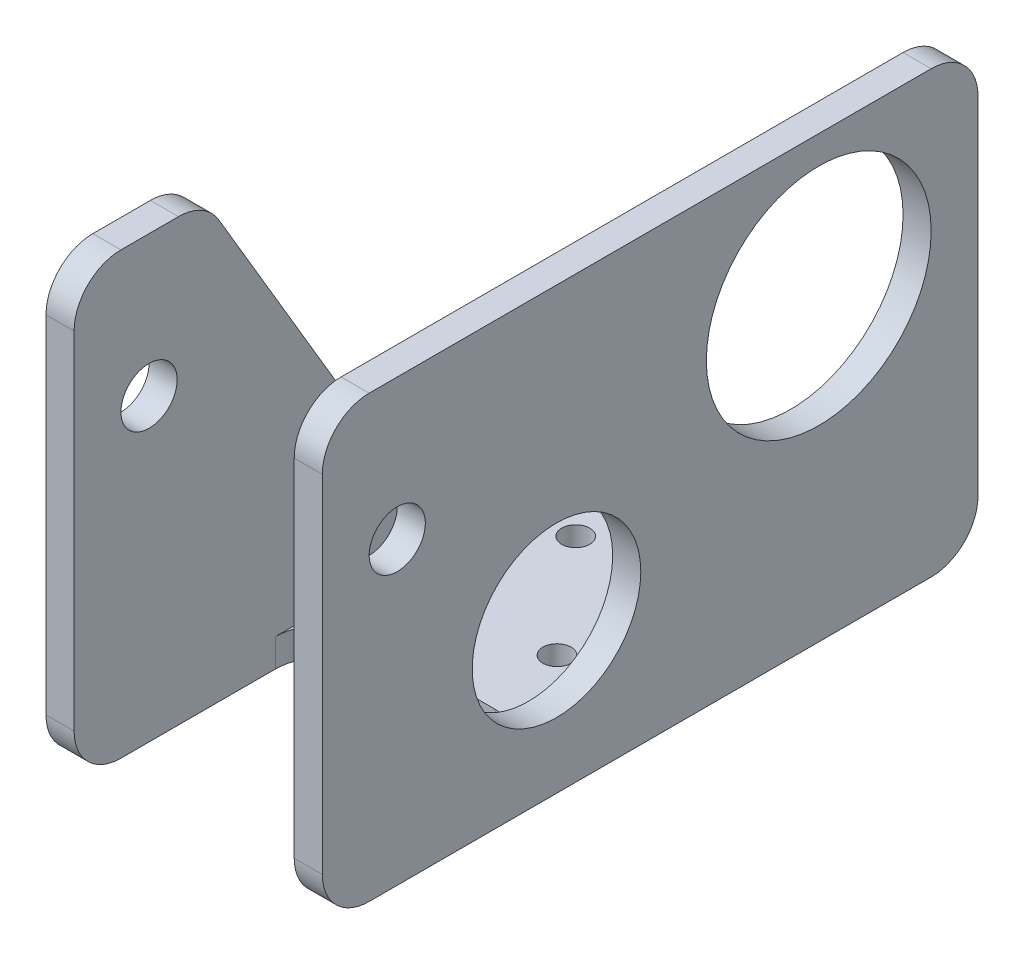
ISO-10303-21;
HEADER;
FILE_DESCRIPTION(('STEP AP214'),'2;1');
FILE_NAME('part.step','',(''),(''),'','','');
FILE_SCHEMA(('AUTOMOTIVE_DESIGN { 1 0 10303 214 1 1 1 1 }'));
ENDSEC;
DATA;
#1=APPLICATION_CONTEXT('core data for automotive mechanical design processes');
#2=APPLICATION_PROTOCOL_DEFINITION('international standard','automotive_design',2000,#1);
#3=PRODUCT_CONTEXT('',#1,'mechanical');
#4=PRODUCT('Part','Part','',(#3));
#5=PRODUCT_RELATED_PRODUCT_CATEGORY('part','',(#4));
#6=PRODUCT_DEFINITION_FORMATION('','',#4);
#7=PRODUCT_DEFINITION_CONTEXT('part definition',#1,'design');
#8=PRODUCT_DEFINITION('design','',#6,#7);
#9=PRODUCT_DEFINITION_SHAPE('','',#8);
#10=(LENGTH_UNIT() NAMED_UNIT(*) SI_UNIT(.MILLI.,.METRE.));
#11=(NAMED_UNIT(*) PLANE_ANGLE_UNIT() SI_UNIT($,.RADIAN.));
#12=(NAMED_UNIT(*) SI_UNIT($,.STERADIAN.) SOLID_ANGLE_UNIT());
#13=UNCERTAINTY_MEASURE_WITH_UNIT(LENGTH_MEASURE(1.E-05),#10,'distance_accuracy_value','');
#14=(GEOMETRIC_REPRESENTATION_CONTEXT(3) GLOBAL_UNCERTAINTY_ASSIGNED_CONTEXT((#13)) GLOBAL_UNIT_ASSIGNED_CONTEXT((#10,
#11,#12)) REPRESENTATION_CONTEXT('',''));
#15=CARTESIAN_POINT('',(0.,0.,0.));
#16=DIRECTION('',(0.,0.,1.));
#17=DIRECTION('',(1.,0.,0.));
#18=AXIS2_PLACEMENT_3D('',#15,#16,#17);
#19=CARTESIAN_POINT('',(0.,0.,70.));
#20=DIRECTION('',(0.,0.,-1.));
#21=DIRECTION('',(-1.,0.,0.));
#22=AXIS2_PLACEMENT_3D('',#19,#20,#21);
#23=PLANE('',#22);
#24=DIRECTION('',(0.,-1.,0.));
#25=VECTOR('',#24,1.);
#26=CARTESIAN_POINT('',(3.,3.,70.));
#27=LINE('',#26,#25);
#28=CARTESIAN_POINT('',(3.,42.,70.));
#29=VERTEX_POINT('',#28);
#30=CARTESIAN_POINT('',(3.,5.,70.));
#31=VERTEX_POINT('',#30);
#32=EDGE_CURVE('E263',#29,#31,#27,.T.);
#33=ORIENTED_EDGE('',*,*,#32,.F.);
#34=DIRECTION('',(-1.,0.,0.));
#35=VECTOR('',#34,1.);
#36=CARTESIAN_POINT('',(0.,42.,70.));
#37=LINE('',#36,#35);
#38=CARTESIAN_POINT('',(0.,42.,70.));
#39=VERTEX_POINT('',#38);
#40=EDGE_CURVE('E387',#29,#39,#37,.T.);
#41=ORIENTED_EDGE('',*,*,#40,.T.);
#42=DIRECTION('',(0.,-1.,0.));
#43=VECTOR('',#42,1.);
#44=CARTESIAN_POINT('',(0.,0.,70.));
#45=LINE('',#44,#43);
#46=CARTESIAN_POINT('',(0.,5.,70.));
#47=VERTEX_POINT('',#46);
#48=EDGE_CURVE('E277',#39,#47,#45,.T.);
#49=ORIENTED_EDGE('',*,*,#48,.T.);
#50=DIRECTION('',(1.,0.,0.));
#51=VECTOR('',#50,1.);
#52=CARTESIAN_POINT('',(0.,5.,70.));
#53=LINE('',#52,#51);
#54=EDGE_CURVE('E313',#47,#31,#53,.T.);
#55=ORIENTED_EDGE('',*,*,#54,.T.);
#56=EDGE_LOOP('',(#33,#41,#49,#55));
#57=FACE_BOUND('',#56,.T.);
#58=ADVANCED_FACE('F35',(#57),#23,.F.);
#59=CARTESIAN_POINT('',(0.,47.,70.));
#60=DIRECTION('',(0.,-1.,0.));
#61=DIRECTION('',(0.,0.,-1.));
#62=AXIS2_PLACEMENT_3D('',#59,#60,#61);
#63=PLANE('',#62);
#64=DIRECTION('',(0.,0.,1.));
#65=VECTOR('',#64,1.);
#66=CARTESIAN_POINT('',(3.,47.,0.));
#67=LINE('',#66,#65);
#68=CARTESIAN_POINT('',(3.,47.,58.8531510632639));
#69=VERTEX_POINT('',#68);
#70=CARTESIAN_POINT('',(3.,47.,65.));
#71=VERTEX_POINT('',#70);
#72=EDGE_CURVE('E267',#69,#71,#67,.T.);
#73=ORIENTED_EDGE('',*,*,#72,.F.);
#74=DIRECTION('',(1.,0.,0.));
#75=VECTOR('',#74,1.);
#76=CARTESIAN_POINT('',(0.,47.,58.8531510632639));
#77=LINE('',#76,#75);
#78=CARTESIAN_POINT('',(0.,47.,58.8531510632639));
#79=VERTEX_POINT('',#78);
#80=EDGE_CURVE('E350',#69,#79,#77,.F.);
#81=ORIENTED_EDGE('',*,*,#80,.T.);
#82=DIRECTION('',(0.,0.,-1.));
#83=VECTOR('',#82,1.);
#84=CARTESIAN_POINT('',(0.,47.,70.));
#85=LINE('',#84,#83);
#86=CARTESIAN_POINT('',(0.,47.,65.));
#87=VERTEX_POINT('',#86);
#88=EDGE_CURVE('E281',#87,#79,#85,.T.);
#89=ORIENTED_EDGE('',*,*,#88,.F.);
#90=DIRECTION('',(-1.,0.,0.));
#91=VECTOR('',#90,1.);
#92=CARTESIAN_POINT('',(0.,47.,65.));
#93=LINE('',#92,#91);
#94=EDGE_CURVE('E348',#87,#71,#93,.F.);
#95=ORIENTED_EDGE('',*,*,#94,.T.);
#96=EDGE_LOOP('',(#73,#81,#89,#95));
#97=FACE_BOUND('',#96,.T.);
#98=ADVANCED_FACE('F469',(#97),#63,.F.);
#99=CARTESIAN_POINT('',(0.,0.,70.));
#100=DIRECTION('',(1.,0.,0.));
#101=DIRECTION('',(0.,0.,-1.));
#102=AXIS2_PLACEMENT_3D('',#99,#100,#101);
#103=PLANE('',#102);
#104=CARTESIAN_POINT('',(0.,32.,62.));
#105=DIRECTION('',(1.,0.,0.));
#106=DIRECTION('',(0.,0.,-1.));
#107=AXIS2_PLACEMENT_3D('',#104,#105,#106);
#108=CIRCLE('',#107,3.00000000000001);
#109=CARTESIAN_POINT('',(0.,32.,59.));
#110=VERTEX_POINT('',#109);
#111=EDGE_CURVE('E255',#110,#110,#108,.T.);
#112=ORIENTED_EDGE('',*,*,#111,.T.);
#113=EDGE_LOOP('',(#112));
#114=FACE_BOUND('',#113,.T.);
#115=ORIENTED_EDGE('',*,*,#88,.T.);
#116=CARTESIAN_POINT('',(0.,42.,58.8531510632639));
#117=DIRECTION('',(1.,0.,0.));
#118=DIRECTION('',(0.,0.,-1.));
#119=AXIS2_PLACEMENT_3D('',#116,#117,#118);
#120=CIRCLE('',#119,5.);
#121=CARTESIAN_POINT('',(0.,44.5436465606332,54.5485184221924));
#122=VERTEX_POINT('',#121);
#123=EDGE_CURVE('E357',#79,#122,#120,.F.);
#124=ORIENTED_EDGE('',*,*,#123,.T.);
#125=DIRECTION('',(0.,-0.860926528214316,-0.508729312126641));
#126=VECTOR('',#125,1.);
#127=CARTESIAN_POINT('',(0.,18.2955589586524,39.0382848392037));
#128=LINE('',#127,#126);
#129=CARTESIAN_POINT('',(0.,5.45635343936679,31.4514815778076));
#130=VERTEX_POINT('',#129);
#131=EDGE_CURVE('E413',#122,#130,#128,.T.);
#132=ORIENTED_EDGE('',*,*,#131,.T.);
#133=CARTESIAN_POINT('',(0.,8.,27.1468489367361));
#134=DIRECTION('',(1.,0.,0.));
#135=DIRECTION('',(0.,0.,-1.));
#136=AXIS2_PLACEMENT_3D('',#133,#134,#135);
#137=CIRCLE('',#136,5.);
#138=CARTESIAN_POINT('',(0.,3.,27.1468489367361));
#139=VERTEX_POINT('',#138);
#140=EDGE_CURVE('E395',#130,#139,#137,.T.);
#141=ORIENTED_EDGE('',*,*,#140,.T.);
#142=DIRECTION('',(0.,0.,-1.));
#143=VECTOR('',#142,1.);
#144=CARTESIAN_POINT('',(0.,3.,70.));
#145=LINE('',#144,#143);
#146=CARTESIAN_POINT('',(0.,3.,20.));
#147=VERTEX_POINT('',#146);
#148=EDGE_CURVE('E236',#139,#147,#145,.T.);
#149=ORIENTED_EDGE('',*,*,#148,.T.);
#150=DIRECTION('',(0.,-1.,0.));
#151=VECTOR('',#150,1.);
#152=CARTESIAN_POINT('',(0.,0.,20.));
#153=LINE('',#152,#151);
#154=CARTESIAN_POINT('',(0.,0.,20.));
#155=VERTEX_POINT('',#154);
#156=EDGE_CURVE('E354',#147,#155,#153,.T.);
#157=ORIENTED_EDGE('',*,*,#156,.T.);
#158=DIRECTION('',(0.,0.,-1.));
#159=VECTOR('',#158,1.);
#160=CARTESIAN_POINT('',(0.,0.,70.));
#161=LINE('',#160,#159);
#162=CARTESIAN_POINT('',(0.,0.,65.));
#163=VERTEX_POINT('',#162);
#164=EDGE_CURVE('E291',#163,#155,#161,.T.);
#165=ORIENTED_EDGE('',*,*,#164,.F.);
#166=CARTESIAN_POINT('',(0.,5.,65.));
#167=DIRECTION('',(1.,0.,0.));
#168=DIRECTION('',(0.,0.,-1.));
#169=AXIS2_PLACEMENT_3D('',#166,#167,#168);
#170=CIRCLE('',#169,5.);
#171=EDGE_CURVE('E323',#163,#47,#170,.F.);
#172=ORIENTED_EDGE('',*,*,#171,.T.);
#173=ORIENTED_EDGE('',*,*,#48,.F.);
#174=CARTESIAN_POINT('',(0.,42.,65.));
#175=DIRECTION('',(1.,0.,0.));
#176=DIRECTION('',(0.,0.,-1.));
#177=AXIS2_PLACEMENT_3D('',#174,#175,#176);
#178=CIRCLE('',#177,5.);
#179=EDGE_CURVE('E352',#39,#87,#178,.F.);
#180=ORIENTED_EDGE('',*,*,#179,.T.);
#181=EDGE_LOOP('',(#115,#124,#132,#141,#149,#157,#165,#172,#173,#180));
#182=FACE_BOUND('',#181,.T.);
#183=ADVANCED_FACE('F442',(#114,#182),#103,.F.);
#184=CARTESIAN_POINT('',(0.,0.,70.));
#185=DIRECTION('',(0.,1.,0.));
#186=DIRECTION('',(0.,0.,1.));
#187=AXIS2_PLACEMENT_3D('',#184,#185,#186);
#188=PLANE('',#187);
#189=CARTESIAN_POINT('',(19.75,0.,35.2));
#190=DIRECTION('',(0.,-1.,0.));
#191=DIRECTION('',(0.,0.,-1.));
#192=AXIS2_PLACEMENT_3D('',#189,#190,#191);
#193=CIRCLE('',#192,1.5);
#194=CARTESIAN_POINT('',(19.75,0.,33.7));
#195=VERTEX_POINT('',#194);
#196=EDGE_CURVE('E588',#195,#195,#193,.T.);
#197=ORIENTED_EDGE('',*,*,#196,.F.);
#198=EDGE_LOOP('',(#197));
#199=FACE_BOUND('',#198,.T.);
#200=CARTESIAN_POINT('',(19.75,0.,23.2));
#201=DIRECTION('',(0.,-1.,0.));
#202=DIRECTION('',(0.,0.,-1.));
#203=AXIS2_PLACEMENT_3D('',#200,#201,#202);
#204=CIRCLE('',#203,1.5);
#205=CARTESIAN_POINT('',(19.75,0.,21.7));
#206=VERTEX_POINT('',#205);
#207=EDGE_CURVE('E585',#206,#206,#204,.T.);
#208=ORIENTED_EDGE('',*,*,#207,.F.);
#209=EDGE_LOOP('',(#208));
#210=FACE_BOUND('',#209,.T.);
#211=CARTESIAN_POINT('',(9.75,0.,23.2));
#212=DIRECTION('',(0.,-1.,0.));
#213=DIRECTION('',(0.,0.,-1.));
#214=AXIS2_PLACEMENT_3D('',#211,#212,#213);
#215=CIRCLE('',#214,1.5);
#216=CARTESIAN_POINT('',(9.75,0.,21.7));
#217=VERTEX_POINT('',#216);
#218=EDGE_CURVE('E587',#217,#217,#215,.T.);
#219=ORIENTED_EDGE('',*,*,#218,.F.);
#220=EDGE_LOOP('',(#219));
#221=FACE_BOUND('',#220,.T.);
#222=CARTESIAN_POINT('',(9.75,0.,35.2));
#223=DIRECTION('',(0.,-1.,0.));
#224=DIRECTION('',(0.,0.,-1.));
#225=AXIS2_PLACEMENT_3D('',#222,#223,#224);
#226=CIRCLE('',#225,1.5);
#227=CARTESIAN_POINT('',(9.75,0.,33.7));
#228=VERTEX_POINT('',#227);
#229=EDGE_CURVE('E402',#228,#228,#226,.T.);
#230=ORIENTED_EDGE('',*,*,#229,.F.);
#231=EDGE_LOOP('',(#230));
#232=FACE_BOUND('',#231,.T.);
#233=ORIENTED_EDGE('',*,*,#164,.T.);
#234=CARTESIAN_POINT('',(5.,0.,20.));
#235=DIRECTION('',(0.,1.,0.));
#236=DIRECTION('',(0.,0.,1.));
#237=AXIS2_PLACEMENT_3D('',#234,#235,#236);
#238=CIRCLE('',#237,5.);
#239=CARTESIAN_POINT('',(5.,0.,15.));
#240=VERTEX_POINT('',#239);
#241=EDGE_CURVE('E364',#155,#240,#238,.F.);
#242=ORIENTED_EDGE('',*,*,#241,.T.);
#243=DIRECTION('',(-1.,0.,0.));
#244=VECTOR('',#243,1.);
#245=CARTESIAN_POINT('',(26.5,0.,15.));
#246=LINE('',#245,#244);
#247=CARTESIAN_POINT('',(21.5,0.,15.));
#248=VERTEX_POINT('',#247);
#249=EDGE_CURVE('E244',#248,#240,#246,.T.);
#250=ORIENTED_EDGE('',*,*,#249,.F.);
#251=CARTESIAN_POINT('',(21.5,0.,10.));
#252=DIRECTION('',(0.,1.,0.));
#253=DIRECTION('',(0.,0.,1.));
#254=AXIS2_PLACEMENT_3D('',#251,#252,#253);
#255=CIRCLE('',#254,5.);
#256=CARTESIAN_POINT('',(26.5,0.,10.));
#257=VERTEX_POINT('',#256);
#258=EDGE_CURVE('E44',#248,#257,#255,.T.);
#259=ORIENTED_EDGE('',*,*,#258,.T.);
#260=DIRECTION('',(0.,0.,1.));
#261=VECTOR('',#260,1.);
#262=CARTESIAN_POINT('',(26.5,0.,0.));
#263=LINE('',#262,#261);
#264=CARTESIAN_POINT('',(26.5,0.,5.));
#265=VERTEX_POINT('',#264);
#266=EDGE_CURVE('E234',#265,#257,#263,.T.);
#267=ORIENTED_EDGE('',*,*,#266,.F.);
#268=DIRECTION('',(1.,0.,0.));
#269=VECTOR('',#268,1.);
#270=CARTESIAN_POINT('',(29.5,0.,5.));
#271=LINE('',#270,#269);
#272=CARTESIAN_POINT('',(29.5,0.,5.));
#273=VERTEX_POINT('',#272);
#274=EDGE_CURVE('E318',#265,#273,#271,.T.);
#275=ORIENTED_EDGE('',*,*,#274,.T.);
#276=DIRECTION('',(0.,0.,-1.));
#277=VECTOR('',#276,1.);
#278=CARTESIAN_POINT('',(29.5,0.,70.));
#279=LINE('',#278,#277);
#280=CARTESIAN_POINT('',(29.5,0.,65.));
#281=VERTEX_POINT('',#280);
#282=EDGE_CURVE('E288',#281,#273,#279,.T.);
#283=ORIENTED_EDGE('',*,*,#282,.F.);
#284=DIRECTION('',(1.,0.,0.));
#285=VECTOR('',#284,1.);
#286=CARTESIAN_POINT('',(0.,0.,65.));
#287=LINE('',#286,#285);
#288=CARTESIAN_POINT('',(26.5,0.,65.));
#289=VERTEX_POINT('',#288);
#290=EDGE_CURVE('E316',#281,#289,#287,.F.);
#291=ORIENTED_EDGE('',*,*,#290,.T.);
#292=DIRECTION('',(0.,0.,1.));
#293=VECTOR('',#292,1.);
#294=CARTESIAN_POINT('',(26.5,0.,70.));
#295=LINE('',#294,#293);
#296=CARTESIAN_POINT('',(26.5,0.,48.5));
#297=VERTEX_POINT('',#296);
#298=EDGE_CURVE('E230',#297,#289,#295,.T.);
#299=ORIENTED_EDGE('',*,*,#298,.F.);
#300=CARTESIAN_POINT('',(21.5,0.,48.5));
#301=DIRECTION('',(0.,1.,0.));
#302=DIRECTION('',(0.,0.,1.));
#303=AXIS2_PLACEMENT_3D('',#300,#301,#302);
#304=CIRCLE('',#303,5.);
#305=CARTESIAN_POINT('',(21.5,0.,43.5));
#306=VERTEX_POINT('',#305);
#307=EDGE_CURVE('E229',#297,#306,#304,.T.);
#308=ORIENTED_EDGE('',*,*,#307,.T.);
#309=DIRECTION('',(1.,0.,0.));
#310=VECTOR('',#309,1.);
#311=CARTESIAN_POINT('',(3.,0.,43.5));
#312=LINE('',#311,#310);
#313=CARTESIAN_POINT('',(8.,0.,43.5));
#314=VERTEX_POINT('',#313);
#315=EDGE_CURVE('E219',#314,#306,#312,.T.);
#316=ORIENTED_EDGE('',*,*,#315,.F.);
#317=CARTESIAN_POINT('',(8.,0.,48.5));
#318=DIRECTION('',(0.,1.,0.));
#319=DIRECTION('',(0.,0.,1.));
#320=AXIS2_PLACEMENT_3D('',#317,#318,#319);
#321=CIRCLE('',#320,5.);
#322=CARTESIAN_POINT('',(3.,0.,48.5));
#323=VERTEX_POINT('',#322);
#324=EDGE_CURVE('E201',#314,#323,#321,.T.);
#325=ORIENTED_EDGE('',*,*,#324,.T.);
#326=DIRECTION('',(0.,0.,-1.));
#327=VECTOR('',#326,1.);
#328=CARTESIAN_POINT('',(3.,0.,70.));
#329=LINE('',#328,#327);
#330=CARTESIAN_POINT('',(3.,0.,65.));
#331=VERTEX_POINT('',#330);
#332=EDGE_CURVE('E231',#331,#323,#329,.T.);
#333=ORIENTED_EDGE('',*,*,#332,.F.);
#334=DIRECTION('',(1.,0.,0.));
#335=VECTOR('',#334,1.);
#336=CARTESIAN_POINT('',(0.,0.,65.));
#337=LINE('',#336,#335);
#338=EDGE_CURVE('E321',#331,#163,#337,.F.);
#339=ORIENTED_EDGE('',*,*,#338,.T.);
#340=EDGE_LOOP('',(#233,#242,#250,#259,#267,#275,#283,#291,#299,#308,#316,#325,#333,#339));
#341=FACE_BOUND('',#340,.T.);
#342=ADVANCED_FACE('F227',(#199,#210,#221,#232,#341),#188,.F.);
#343=CARTESIAN_POINT('',(29.5,0.,70.));
#344=DIRECTION('',(-1.,0.,0.));
#345=DIRECTION('',(0.,0.,1.));
#346=AXIS2_PLACEMENT_3D('',#343,#344,#345);
#347=PLANE('',#346);
#348=CARTESIAN_POINT('',(29.5,16.,45.));
#349=DIRECTION('',(1.,0.,0.));
#350=DIRECTION('',(0.,0.,-1.));
#351=AXIS2_PLACEMENT_3D('',#348,#349,#350);
#352=CIRCLE('',#351,9.00000000000001);
#353=CARTESIAN_POINT('',(29.5,16.,36.));
#354=VERTEX_POINT('',#353);
#355=EDGE_CURVE('E240',#354,#354,#352,.T.);
#356=ORIENTED_EDGE('',*,*,#355,.F.);
#357=EDGE_LOOP('',(#356));
#358=FACE_BOUND('',#357,.T.);
#359=CARTESIAN_POINT('',(29.5,32.,17.));
#360=DIRECTION('',(1.,0.,0.));
#361=DIRECTION('',(0.,0.,-1.));
#362=AXIS2_PLACEMENT_3D('',#359,#360,#361);
#363=CIRCLE('',#362,12.);
#364=CARTESIAN_POINT('',(29.5,32.,5.00000000000001));
#365=VERTEX_POINT('',#364);
#366=EDGE_CURVE('E245',#365,#365,#363,.T.);
#367=ORIENTED_EDGE('',*,*,#366,.F.);
#368=EDGE_LOOP('',(#367));
#369=FACE_BOUND('',#368,.T.);
#370=CARTESIAN_POINT('',(29.5,32.,62.));
#371=DIRECTION('',(1.,0.,0.));
#372=DIRECTION('',(0.,0.,-1.));
#373=AXIS2_PLACEMENT_3D('',#370,#371,#372);
#374=CIRCLE('',#373,3.00000000000001);
#375=CARTESIAN_POINT('',(29.5,32.,59.));
#376=VERTEX_POINT('',#375);
#377=EDGE_CURVE('E249',#376,#376,#374,.T.);
#378=ORIENTED_EDGE('',*,*,#377,.F.);
#379=EDGE_LOOP('',(#378));
#380=FACE_BOUND('',#379,.T.);
#381=DIRECTION('',(0.,1.,0.));
#382=VECTOR('',#381,1.);
#383=CARTESIAN_POINT('',(29.5,0.,0.));
#384=LINE('',#383,#382);
#385=CARTESIAN_POINT('',(29.5,5.,0.));
#386=VERTEX_POINT('',#385);
#387=CARTESIAN_POINT('',(29.5,42.,0.));
#388=VERTEX_POINT('',#387);
#389=EDGE_CURVE('E270',#386,#388,#384,.T.);
#390=ORIENTED_EDGE('',*,*,#389,.T.);
#391=CARTESIAN_POINT('',(29.5,42.,5.));
#392=DIRECTION('',(-1.,0.,0.));
#393=DIRECTION('',(0.,0.,1.));
#394=AXIS2_PLACEMENT_3D('',#391,#392,#393);
#395=CIRCLE('',#394,5.);
#396=CARTESIAN_POINT('',(29.5,47.,5.));
#397=VERTEX_POINT('',#396);
#398=EDGE_CURVE('E385',#388,#397,#395,.F.);
#399=ORIENTED_EDGE('',*,*,#398,.T.);
#400=DIRECTION('',(0.,0.,-1.));
#401=VECTOR('',#400,1.);
#402=CARTESIAN_POINT('',(29.5,47.,70.));
#403=LINE('',#402,#401);
#404=CARTESIAN_POINT('',(29.5,47.,65.));
#405=VERTEX_POINT('',#404);
#406=EDGE_CURVE('E285',#405,#397,#403,.T.);
#407=ORIENTED_EDGE('',*,*,#406,.F.);
#408=CARTESIAN_POINT('',(29.5,42.,65.));
#409=DIRECTION('',(-1.,0.,0.));
#410=DIRECTION('',(0.,0.,1.));
#411=AXIS2_PLACEMENT_3D('',#408,#409,#410);
#412=CIRCLE('',#411,5.);
#413=CARTESIAN_POINT('',(29.5,42.,70.));
#414=VERTEX_POINT('',#413);
#415=EDGE_CURVE('E52',#405,#414,#412,.F.);
#416=ORIENTED_EDGE('',*,*,#415,.T.);
#417=DIRECTION('',(0.,1.,0.));
#418=VECTOR('',#417,1.);
#419=CARTESIAN_POINT('',(29.5,0.,70.));
#420=LINE('',#419,#418);
#421=CARTESIAN_POINT('',(29.5,5.,70.));
#422=VERTEX_POINT('',#421);
#423=EDGE_CURVE('E279',#422,#414,#420,.T.);
#424=ORIENTED_EDGE('',*,*,#423,.F.);
#425=CARTESIAN_POINT('',(29.5,5.,65.));
#426=DIRECTION('',(-1.,0.,0.));
#427=DIRECTION('',(0.,0.,1.));
#428=AXIS2_PLACEMENT_3D('',#425,#426,#427);
#429=CIRCLE('',#428,5.);
#430=EDGE_CURVE('E326',#422,#281,#429,.F.);
#431=ORIENTED_EDGE('',*,*,#430,.T.);
#432=ORIENTED_EDGE('',*,*,#282,.T.);
#433=CARTESIAN_POINT('',(29.5,5.,5.));
#434=DIRECTION('',(-1.,0.,0.));
#435=DIRECTION('',(0.,0.,1.));
#436=AXIS2_PLACEMENT_3D('',#433,#434,#435);
#437=CIRCLE('',#436,5.);
#438=EDGE_CURVE('E328',#273,#386,#437,.F.);
#439=ORIENTED_EDGE('',*,*,#438,.T.);
#440=EDGE_LOOP('',(#390,#399,#407,#416,#424,#431,#432,#439));
#441=FACE_BOUND('',#440,.T.);
#442=ADVANCED_FACE('F506',(#358,#369,#380,#441),#347,.F.);
#443=ORIENTED_EDGE('',*,*,#406,.T.);
#444=DIRECTION('',(-1.,0.,0.));
#445=VECTOR('',#444,1.);
#446=CARTESIAN_POINT('',(26.5,47.,5.));
#447=LINE('',#446,#445);
#448=CARTESIAN_POINT('',(26.5,47.,5.));
#449=VERTEX_POINT('',#448);
#450=EDGE_CURVE('E380',#397,#449,#447,.T.);
#451=ORIENTED_EDGE('',*,*,#450,.T.);
#452=DIRECTION('',(0.,0.,1.));
#453=VECTOR('',#452,1.);
#454=CARTESIAN_POINT('',(26.5,47.,0.));
#455=LINE('',#454,#453);
#456=CARTESIAN_POINT('',(26.5,47.,65.));
#457=VERTEX_POINT('',#456);
#458=EDGE_CURVE('E271',#449,#457,#455,.T.);
#459=ORIENTED_EDGE('',*,*,#458,.T.);
#460=DIRECTION('',(-1.,0.,0.));
#461=VECTOR('',#460,1.);
#462=CARTESIAN_POINT('',(0.,47.,65.));
#463=LINE('',#462,#461);
#464=EDGE_CURVE('E378',#457,#405,#463,.F.);
#465=ORIENTED_EDGE('',*,*,#464,.T.);
#466=EDGE_LOOP('',(#443,#451,#459,#465));
#467=FACE_BOUND('',#466,.T.);
#468=ADVANCED_FACE('F496',(#467),#63,.F.);
#469=ORIENTED_EDGE('',*,*,#423,.T.);
#470=DIRECTION('',(-1.,0.,0.));
#471=VECTOR('',#470,1.);
#472=CARTESIAN_POINT('',(0.,42.,70.));
#473=LINE('',#472,#471);
#474=CARTESIAN_POINT('',(26.5,42.,70.));
#475=VERTEX_POINT('',#474);
#476=EDGE_CURVE('E390',#414,#475,#473,.T.);
#477=ORIENTED_EDGE('',*,*,#476,.T.);
#478=DIRECTION('',(0.,1.,0.));
#479=VECTOR('',#478,1.);
#480=CARTESIAN_POINT('',(26.5,3.,70.));
#481=LINE('',#480,#479);
#482=CARTESIAN_POINT('',(26.5,5.,70.));
#483=VERTEX_POINT('',#482);
#484=EDGE_CURVE('E262',#483,#475,#481,.T.);
#485=ORIENTED_EDGE('',*,*,#484,.F.);
#486=DIRECTION('',(1.,0.,0.));
#487=VECTOR('',#486,1.);
#488=CARTESIAN_POINT('',(0.,5.,70.));
#489=LINE('',#488,#487);
#490=EDGE_CURVE('E213',#483,#422,#489,.T.);
#491=ORIENTED_EDGE('',*,*,#490,.T.);
#492=EDGE_LOOP('',(#469,#477,#485,#491));
#493=FACE_BOUND('',#492,.T.);
#494=ADVANCED_FACE('F491',(#493),#23,.F.);
#495=CARTESIAN_POINT('',(0.,0.,0.));
#496=DIRECTION('',(0.,0.,-1.));
#497=DIRECTION('',(-1.,0.,0.));
#498=AXIS2_PLACEMENT_3D('',#495,#496,#497);
#499=PLANE('',#498);
#500=DIRECTION('',(0.,1.,0.));
#501=VECTOR('',#500,1.);
#502=CARTESIAN_POINT('',(26.5,3.,0.));
#503=LINE('',#502,#501);
#504=CARTESIAN_POINT('',(26.5,5.,0.));
#505=VERTEX_POINT('',#504);
#506=CARTESIAN_POINT('',(26.5,42.,0.));
#507=VERTEX_POINT('',#506);
#508=EDGE_CURVE('E259',#505,#507,#503,.T.);
#509=ORIENTED_EDGE('',*,*,#508,.T.);
#510=DIRECTION('',(-1.,0.,0.));
#511=VECTOR('',#510,1.);
#512=CARTESIAN_POINT('',(29.5,42.,0.));
#513=LINE('',#512,#511);
#514=EDGE_CURVE('E60',#507,#388,#513,.F.);
#515=ORIENTED_EDGE('',*,*,#514,.T.);
#516=ORIENTED_EDGE('',*,*,#389,.F.);
#517=DIRECTION('',(1.,0.,0.));
#518=VECTOR('',#517,1.);
#519=CARTESIAN_POINT('',(26.5,5.,0.));
#520=LINE('',#519,#518);
#521=EDGE_CURVE('E330',#386,#505,#520,.F.);
#522=ORIENTED_EDGE('',*,*,#521,.T.);
#523=EDGE_LOOP('',(#509,#515,#516,#522));
#524=FACE_BOUND('',#523,.T.);
#525=ADVANCED_FACE('F500',(#524),#499,.T.);
#526=CARTESIAN_POINT('',(3.,3.,0.));
#527=DIRECTION('',(-1.,0.,0.));
#528=DIRECTION('',(0.,0.,1.));
#529=AXIS2_PLACEMENT_3D('',#526,#527,#528);
#530=PLANE('',#529);
#531=DIRECTION('',(0.,-0.860926528214316,-0.508729312126641));
#532=VECTOR('',#531,1.);
#533=CARTESIAN_POINT('',(3.,3.,30.));
#534=LINE('',#533,#532);
#535=CARTESIAN_POINT('',(3.,44.5436465606332,54.5485184221924));
#536=VERTEX_POINT('',#535);
#537=CARTESIAN_POINT('',(3.,5.4563534393668,31.4514815778077));
#538=VERTEX_POINT('',#537);
#539=EDGE_CURVE('E409',#536,#538,#534,.T.);
#540=ORIENTED_EDGE('',*,*,#539,.F.);
#541=CARTESIAN_POINT('',(3.,42.,58.8531510632639));
#542=DIRECTION('',(-1.,0.,0.));
#543=DIRECTION('',(0.,0.,1.));
#544=AXIS2_PLACEMENT_3D('',#541,#542,#543);
#545=CIRCLE('',#544,5.);
#546=EDGE_CURVE('E346',#536,#69,#545,.F.);
#547=ORIENTED_EDGE('',*,*,#546,.T.);
#548=ORIENTED_EDGE('',*,*,#72,.T.);
#549=CARTESIAN_POINT('',(3.,42.,65.));
#550=DIRECTION('',(-1.,0.,0.));
#551=DIRECTION('',(0.,0.,1.));
#552=AXIS2_PLACEMENT_3D('',#549,#550,#551);
#553=CIRCLE('',#552,5.);
#554=EDGE_CURVE('E344',#71,#29,#553,.F.);
#555=ORIENTED_EDGE('',*,*,#554,.T.);
#556=ORIENTED_EDGE('',*,*,#32,.T.);
#557=CARTESIAN_POINT('',(3.,5.,65.));
#558=DIRECTION('',(-1.,0.,0.));
#559=DIRECTION('',(0.,0.,1.));
#560=AXIS2_PLACEMENT_3D('',#557,#558,#559);
#561=CIRCLE('',#560,5.);
#562=EDGE_CURVE('E223',#31,#331,#561,.F.);
#563=ORIENTED_EDGE('',*,*,#562,.T.);
#564=ORIENTED_EDGE('',*,*,#332,.T.);
#565=DIRECTION('',(0.,-1.,0.));
#566=VECTOR('',#565,1.);
#567=CARTESIAN_POINT('',(3.,3.,48.5));
#568=LINE('',#567,#566);
#569=CARTESIAN_POINT('',(3.,3.,48.5));
#570=VERTEX_POINT('',#569);
#571=EDGE_CURVE('E207',#323,#570,#568,.F.);
#572=ORIENTED_EDGE('',*,*,#571,.T.);
#573=DIRECTION('',(0.,0.,1.));
#574=VECTOR('',#573,1.);
#575=CARTESIAN_POINT('',(3.,3.,0.));
#576=LINE('',#575,#574);
#577=CARTESIAN_POINT('',(3.,3.,27.1468489367361));
#578=VERTEX_POINT('',#577);
#579=EDGE_CURVE('E261',#578,#570,#576,.T.);
#580=ORIENTED_EDGE('',*,*,#579,.F.);
#581=CARTESIAN_POINT('',(3.,8.,27.1468489367361));
#582=DIRECTION('',(-1.,0.,0.));
#583=DIRECTION('',(0.,0.,1.));
#584=AXIS2_PLACEMENT_3D('',#581,#582,#583);
#585=CIRCLE('',#584,5.);
#586=EDGE_CURVE('E393',#578,#538,#585,.T.);
#587=ORIENTED_EDGE('',*,*,#586,.T.);
#588=EDGE_LOOP('',(#540,#547,#548,#555,#556,#563,#564,#572,#580,#587));
#589=FACE_BOUND('',#588,.T.);
#590=CARTESIAN_POINT('',(3.,32.,62.));
#591=DIRECTION('',(-1.,0.,0.));
#592=DIRECTION('',(0.,0.,1.));
#593=AXIS2_PLACEMENT_3D('',#590,#591,#592);
#594=CIRCLE('',#593,3.00000000000001);
#595=CARTESIAN_POINT('',(3.,32.,65.));
#596=VERTEX_POINT('',#595);
#597=EDGE_CURVE('E252',#596,#596,#594,.T.);
#598=ORIENTED_EDGE('',*,*,#597,.T.);
#599=EDGE_LOOP('',(#598));
#600=FACE_BOUND('',#599,.T.);
#601=ADVANCED_FACE('F450',(#589,#600),#530,.F.);
#602=CARTESIAN_POINT('',(26.5,3.,0.));
#603=DIRECTION('',(1.,0.,0.));
#604=DIRECTION('',(0.,0.,-1.));
#605=AXIS2_PLACEMENT_3D('',#602,#603,#604);
#606=PLANE('',#605);
#607=ORIENTED_EDGE('',*,*,#266,.T.);
#608=DIRECTION('',(0.,-1.,0.));
#609=VECTOR('',#608,1.);
#610=CARTESIAN_POINT('',(26.5,3.,10.));
#611=LINE('',#610,#609);
#612=CARTESIAN_POINT('',(26.5,3.,10.));
#613=VERTEX_POINT('',#612);
#614=EDGE_CURVE('E375',#257,#613,#611,.F.);
#615=ORIENTED_EDGE('',*,*,#614,.T.);
#616=DIRECTION('',(0.,0.,1.));
#617=VECTOR('',#616,1.);
#618=CARTESIAN_POINT('',(26.5,3.,0.));
#619=LINE('',#618,#617);
#620=CARTESIAN_POINT('',(26.5,3.,48.5));
#621=VERTEX_POINT('',#620);
#622=EDGE_CURVE('E274',#613,#621,#619,.T.);
#623=ORIENTED_EDGE('',*,*,#622,.T.);
#624=DIRECTION('',(0.,-1.,0.));
#625=VECTOR('',#624,1.);
#626=CARTESIAN_POINT('',(26.5,0.,48.5));
#627=LINE('',#626,#625);
#628=EDGE_CURVE('E310',#621,#297,#627,.T.);
#629=ORIENTED_EDGE('',*,*,#628,.T.);
#630=ORIENTED_EDGE('',*,*,#298,.T.);
#631=CARTESIAN_POINT('',(26.5,5.,65.));
#632=DIRECTION('',(1.,0.,0.));
#633=DIRECTION('',(0.,0.,-1.));
#634=AXIS2_PLACEMENT_3D('',#631,#632,#633);
#635=CIRCLE('',#634,5.);
#636=EDGE_CURVE('E306',#289,#483,#635,.F.);
#637=ORIENTED_EDGE('',*,*,#636,.T.);
#638=ORIENTED_EDGE('',*,*,#484,.T.);
#639=CARTESIAN_POINT('',(26.5,42.,65.));
#640=DIRECTION('',(1.,0.,0.));
#641=DIRECTION('',(0.,0.,-1.));
#642=AXIS2_PLACEMENT_3D('',#639,#640,#641);
#643=CIRCLE('',#642,5.);
#644=EDGE_CURVE('E371',#475,#457,#643,.F.);
#645=ORIENTED_EDGE('',*,*,#644,.T.);
#646=ORIENTED_EDGE('',*,*,#458,.F.);
#647=CARTESIAN_POINT('',(26.5,42.,5.));
#648=DIRECTION('',(1.,0.,0.));
#649=DIRECTION('',(0.,0.,-1.));
#650=AXIS2_PLACEMENT_3D('',#647,#648,#649);
#651=CIRCLE('',#650,5.);
#652=EDGE_CURVE('E373',#449,#507,#651,.F.);
#653=ORIENTED_EDGE('',*,*,#652,.T.);
#654=ORIENTED_EDGE('',*,*,#508,.F.);
#655=CARTESIAN_POINT('',(26.5,5.,5.));
#656=DIRECTION('',(1.,0.,0.));
#657=DIRECTION('',(0.,0.,-1.));
#658=AXIS2_PLACEMENT_3D('',#655,#656,#657);
#659=CIRCLE('',#658,5.);
#660=EDGE_CURVE('E308',#505,#265,#659,.F.);
#661=ORIENTED_EDGE('',*,*,#660,.T.);
#662=EDGE_LOOP('',(#607,#615,#623,#629,#630,#637,#638,#645,#646,#653,#654,#661));
#663=FACE_BOUND('',#662,.T.);
#664=CARTESIAN_POINT('',(26.5,16.,45.));
#665=DIRECTION('',(1.,0.,0.));
#666=DIRECTION('',(0.,0.,-1.));
#667=AXIS2_PLACEMENT_3D('',#664,#665,#666);
#668=CIRCLE('',#667,9.00000000000001);
#669=CARTESIAN_POINT('',(26.5,16.,36.));
#670=VERTEX_POINT('',#669);
#671=EDGE_CURVE('E243',#670,#670,#668,.T.);
#672=ORIENTED_EDGE('',*,*,#671,.T.);
#673=EDGE_LOOP('',(#672));
#674=FACE_BOUND('',#673,.T.);
#675=CARTESIAN_POINT('',(26.5,32.,17.));
#676=DIRECTION('',(1.,0.,0.));
#677=DIRECTION('',(0.,0.,-1.));
#678=AXIS2_PLACEMENT_3D('',#675,#676,#677);
#679=CIRCLE('',#678,12.);
#680=CARTESIAN_POINT('',(26.5,32.,5.00000000000001));
#681=VERTEX_POINT('',#680);
#682=EDGE_CURVE('E258',#681,#681,#679,.T.);
#683=ORIENTED_EDGE('',*,*,#682,.T.);
#684=EDGE_LOOP('',(#683));
#685=FACE_BOUND('',#684,.T.);
#686=CARTESIAN_POINT('',(26.5,32.,62.));
#687=DIRECTION('',(1.,0.,0.));
#688=DIRECTION('',(0.,0.,-1.));
#689=AXIS2_PLACEMENT_3D('',#686,#687,#688);
#690=CIRCLE('',#689,3.00000000000001);
#691=CARTESIAN_POINT('',(26.5,32.,59.));
#692=VERTEX_POINT('',#691);
#693=EDGE_CURVE('E248',#692,#692,#690,.T.);
#694=ORIENTED_EDGE('',*,*,#693,.T.);
#695=EDGE_LOOP('',(#694));
#696=FACE_BOUND('',#695,.T.);
#697=ADVANCED_FACE('F515',(#663,#674,#685,#696),#606,.F.);
#698=CARTESIAN_POINT('',(3.,3.,0.));
#699=DIRECTION('',(0.,-1.,0.));
#700=DIRECTION('',(0.,0.,-1.));
#701=AXIS2_PLACEMENT_3D('',#698,#699,#700);
#702=PLANE('',#701);
#703=CARTESIAN_POINT('',(19.75,3.,35.2));
#704=DIRECTION('',(0.,-1.,0.));
#705=DIRECTION('',(0.,0.,-1.));
#706=AXIS2_PLACEMENT_3D('',#703,#704,#705);
#707=CIRCLE('',#706,1.5);
#708=CARTESIAN_POINT('',(19.75,3.,33.7));
#709=VERTEX_POINT('',#708);
#710=EDGE_CURVE('E39',#709,#709,#707,.T.);
#711=ORIENTED_EDGE('',*,*,#710,.T.);
#712=EDGE_LOOP('',(#711));
#713=FACE_BOUND('',#712,.T.);
#714=CARTESIAN_POINT('',(19.75,3.,23.2));
#715=DIRECTION('',(0.,-1.,0.));
#716=DIRECTION('',(0.,0.,-1.));
#717=AXIS2_PLACEMENT_3D('',#714,#715,#716);
#718=CIRCLE('',#717,1.5);
#719=CARTESIAN_POINT('',(19.75,3.,21.7));
#720=VERTEX_POINT('',#719);
#721=EDGE_CURVE('E404',#720,#720,#718,.T.);
#722=ORIENTED_EDGE('',*,*,#721,.T.);
#723=EDGE_LOOP('',(#722));
#724=FACE_BOUND('',#723,.T.);
#725=CARTESIAN_POINT('',(9.75,3.,23.2));
#726=DIRECTION('',(0.,-1.,0.));
#727=DIRECTION('',(0.,0.,-1.));
#728=AXIS2_PLACEMENT_3D('',#725,#726,#727);
#729=CIRCLE('',#728,1.5);
#730=CARTESIAN_POINT('',(9.75,3.,21.7));
#731=VERTEX_POINT('',#730);
#732=EDGE_CURVE('E401',#731,#731,#729,.T.);
#733=ORIENTED_EDGE('',*,*,#732,.T.);
#734=EDGE_LOOP('',(#733));
#735=FACE_BOUND('',#734,.T.);
#736=CARTESIAN_POINT('',(9.75,3.,35.2));
#737=DIRECTION('',(0.,-1.,0.));
#738=DIRECTION('',(0.,0.,-1.));
#739=AXIS2_PLACEMENT_3D('',#736,#737,#738);
#740=CIRCLE('',#739,1.5);
#741=CARTESIAN_POINT('',(9.75,3.,33.7));
#742=VERTEX_POINT('',#741);
#743=EDGE_CURVE('E398',#742,#742,#740,.T.);
#744=ORIENTED_EDGE('',*,*,#743,.T.);
#745=EDGE_LOOP('',(#744));
#746=FACE_BOUND('',#745,.T.);
#747=ORIENTED_EDGE('',*,*,#148,.F.);
#748=DIRECTION('',(1.,0.,0.));
#749=VECTOR('',#748,1.);
#750=CARTESIAN_POINT('',(3.,3.,27.1468489367361));
#751=LINE('',#750,#749);
#752=EDGE_CURVE('E361',#139,#578,#751,.T.);
#753=ORIENTED_EDGE('',*,*,#752,.T.);
#754=ORIENTED_EDGE('',*,*,#579,.T.);
#755=CARTESIAN_POINT('',(8.,3.,48.5));
#756=DIRECTION('',(0.,-1.,0.));
#757=DIRECTION('',(0.,0.,-1.));
#758=AXIS2_PLACEMENT_3D('',#755,#756,#757);
#759=CIRCLE('',#758,5.);
#760=CARTESIAN_POINT('',(8.,3.,43.5));
#761=VERTEX_POINT('',#760);
#762=EDGE_CURVE('E212',#570,#761,#759,.T.);
#763=ORIENTED_EDGE('',*,*,#762,.T.);
#764=DIRECTION('',(1.,0.,0.));
#765=VECTOR('',#764,1.);
#766=CARTESIAN_POINT('',(2.99999999999999,3.,43.5));
#767=LINE('',#766,#765);
#768=CARTESIAN_POINT('',(21.5,3.,43.5));
#769=VERTEX_POINT('',#768);
#770=EDGE_CURVE('E222',#761,#769,#767,.T.);
#771=ORIENTED_EDGE('',*,*,#770,.T.);
#772=CARTESIAN_POINT('',(21.5,3.,48.5));
#773=DIRECTION('',(0.,-1.,0.));
#774=DIRECTION('',(0.,0.,-1.));
#775=AXIS2_PLACEMENT_3D('',#772,#773,#774);
#776=CIRCLE('',#775,5.);
#777=EDGE_CURVE('E336',#769,#621,#776,.T.);
#778=ORIENTED_EDGE('',*,*,#777,.T.);
#779=ORIENTED_EDGE('',*,*,#622,.F.);
#780=CARTESIAN_POINT('',(21.5,3.,10.));
#781=DIRECTION('',(0.,-1.,0.));
#782=DIRECTION('',(0.,0.,-1.));
#783=AXIS2_PLACEMENT_3D('',#780,#781,#782);
#784=CIRCLE('',#783,5.);
#785=CARTESIAN_POINT('',(21.5,3.,15.));
#786=VERTEX_POINT('',#785);
#787=EDGE_CURVE('E11',#613,#786,#784,.T.);
#788=ORIENTED_EDGE('',*,*,#787,.T.);
#789=DIRECTION('',(-1.,0.,0.));
#790=VECTOR('',#789,1.);
#791=CARTESIAN_POINT('',(3.,3.,15.));
#792=LINE('',#791,#790);
#793=CARTESIAN_POINT('',(5.,3.,15.));
#794=VERTEX_POINT('',#793);
#795=EDGE_CURVE('E300',#786,#794,#792,.T.);
#796=ORIENTED_EDGE('',*,*,#795,.T.);
#797=CARTESIAN_POINT('',(5.,3.,20.));
#798=DIRECTION('',(0.,-1.,0.));
#799=DIRECTION('',(0.,0.,-1.));
#800=AXIS2_PLACEMENT_3D('',#797,#798,#799);
#801=CIRCLE('',#800,5.);
#802=EDGE_CURVE('E359',#794,#147,#801,.F.);
#803=ORIENTED_EDGE('',*,*,#802,.T.);
#804=EDGE_LOOP('',(#747,#753,#754,#763,#771,#778,#779,#788,#796,#803));
#805=FACE_BOUND('',#804,.T.);
#806=ADVANCED_FACE('F439',(#713,#724,#735,#746,#805),#702,.F.);
#807=CARTESIAN_POINT('',(-40.5,32.,62.));
#808=DIRECTION('',(1.,0.,0.));
#809=DIRECTION('',(0.,0.,-1.));
#810=AXIS2_PLACEMENT_3D('',#807,#808,#809);
#811=CYLINDRICAL_SURFACE('',#810,3.00000000000001);
#812=ORIENTED_EDGE('',*,*,#377,.T.);
#813=EDGE_LOOP('',(#812));
#814=FACE_BOUND('',#813,.T.);
#815=ORIENTED_EDGE('',*,*,#693,.F.);
#816=EDGE_LOOP('',(#815));
#817=FACE_BOUND('',#816,.T.);
#818=ADVANCED_FACE('F607',(#814,#817),#811,.F.);
#819=CARTESIAN_POINT('',(-40.5,32.,17.));
#820=DIRECTION('',(1.,0.,0.));
#821=DIRECTION('',(0.,0.,-1.));
#822=AXIS2_PLACEMENT_3D('',#819,#820,#821);
#823=CYLINDRICAL_SURFACE('',#822,12.);
#824=ORIENTED_EDGE('',*,*,#366,.T.);
#825=EDGE_LOOP('',(#824));
#826=FACE_BOUND('',#825,.T.);
#827=ORIENTED_EDGE('',*,*,#682,.F.);
#828=EDGE_LOOP('',(#827));
#829=FACE_BOUND('',#828,.T.);
#830=ADVANCED_FACE('F614',(#826,#829),#823,.F.);
#831=ORIENTED_EDGE('',*,*,#597,.F.);
#832=EDGE_LOOP('',(#831));
#833=FACE_BOUND('',#832,.T.);
#834=ORIENTED_EDGE('',*,*,#111,.F.);
#835=EDGE_LOOP('',(#834));
#836=FACE_BOUND('',#835,.T.);
#837=ADVANCED_FACE('F617',(#833,#836),#811,.F.);
#838=CARTESIAN_POINT('',(12.5,16.,45.));
#839=DIRECTION('',(1.,0.,0.));
#840=DIRECTION('',(0.,0.,-1.));
#841=AXIS2_PLACEMENT_3D('',#838,#839,#840);
#842=CYLINDRICAL_SURFACE('',#841,9.00000000000001);
#843=ORIENTED_EDGE('',*,*,#355,.T.);
#844=EDGE_LOOP('',(#843));
#845=FACE_BOUND('',#844,.T.);
#846=ORIENTED_EDGE('',*,*,#671,.F.);
#847=EDGE_LOOP('',(#846));
#848=FACE_BOUND('',#847,.T.);
#849=ADVANCED_FACE('F753',(#845,#848),#842,.F.);
#850=CARTESIAN_POINT('',(3.,10.,43.5));
#851=DIRECTION('',(0.,0.,-1.));
#852=DIRECTION('',(-1.,0.,0.));
#853=AXIS2_PLACEMENT_3D('',#850,#851,#852);
#854=PLANE('',#853);
#855=ORIENTED_EDGE('',*,*,#770,.F.);
#856=DIRECTION('',(0.,-1.,0.));
#857=VECTOR('',#856,1.);
#858=CARTESIAN_POINT('',(8.,0.,43.5));
#859=LINE('',#858,#857);
#860=EDGE_CURVE('E205',#761,#314,#859,.T.);
#861=ORIENTED_EDGE('',*,*,#860,.T.);
#862=ORIENTED_EDGE('',*,*,#315,.T.);
#863=DIRECTION('',(0.,-1.,0.));
#864=VECTOR('',#863,1.);
#865=CARTESIAN_POINT('',(21.5,3.,43.5));
#866=LINE('',#865,#864);
#867=EDGE_CURVE('E224',#306,#769,#866,.F.);
#868=ORIENTED_EDGE('',*,*,#867,.T.);
#869=EDGE_LOOP('',(#855,#861,#862,#868));
#870=FACE_BOUND('',#869,.T.);
#871=ADVANCED_FACE('F218',(#870),#854,.F.);
#872=CARTESIAN_POINT('',(26.5,10.,15.));
#873=DIRECTION('',(0.,0.,1.));
#874=DIRECTION('',(1.,0.,0.));
#875=AXIS2_PLACEMENT_3D('',#872,#873,#874);
#876=PLANE('',#875);
#877=ORIENTED_EDGE('',*,*,#249,.T.);
#878=DIRECTION('',(0.,-1.,0.));
#879=VECTOR('',#878,1.);
#880=CARTESIAN_POINT('',(5.,10.,15.));
#881=LINE('',#880,#879);
#882=EDGE_CURVE('E369',#240,#794,#881,.F.);
#883=ORIENTED_EDGE('',*,*,#882,.T.);
#884=ORIENTED_EDGE('',*,*,#795,.F.);
#885=DIRECTION('',(0.,-1.,0.));
#886=VECTOR('',#885,1.);
#887=CARTESIAN_POINT('',(21.5,0.,15.));
#888=LINE('',#887,#886);
#889=EDGE_CURVE('E366',#786,#248,#888,.T.);
#890=ORIENTED_EDGE('',*,*,#889,.T.);
#891=EDGE_LOOP('',(#877,#883,#884,#890));
#892=FACE_BOUND('',#891,.T.);
#893=ADVANCED_FACE('F430',(#892),#876,.F.);
#894=CARTESIAN_POINT('',(8.,10.,48.5));
#895=DIRECTION('',(0.,1.,0.));
#896=DIRECTION('',(0.,0.,1.));
#897=AXIS2_PLACEMENT_3D('',#894,#895,#896);
#898=CYLINDRICAL_SURFACE('',#897,5.);
#899=ORIENTED_EDGE('',*,*,#762,.F.);
#900=ORIENTED_EDGE('',*,*,#571,.F.);
#901=ORIENTED_EDGE('',*,*,#324,.F.);
#902=ORIENTED_EDGE('',*,*,#860,.F.);
#903=EDGE_LOOP('',(#899,#900,#901,#902));
#904=FACE_BOUND('',#903,.T.);
#905=ADVANCED_FACE('F204',(#904),#898,.F.);
#906=CARTESIAN_POINT('',(21.5,3.,48.5));
#907=DIRECTION('',(0.,1.,0.));
#908=DIRECTION('',(0.,0.,1.));
#909=AXIS2_PLACEMENT_3D('',#906,#907,#908);
#910=CYLINDRICAL_SURFACE('',#909,5.);
#911=ORIENTED_EDGE('',*,*,#777,.F.);
#912=ORIENTED_EDGE('',*,*,#867,.F.);
#913=ORIENTED_EDGE('',*,*,#307,.F.);
#914=ORIENTED_EDGE('',*,*,#628,.F.);
#915=EDGE_LOOP('',(#911,#912,#913,#914));
#916=FACE_BOUND('',#915,.T.);
#917=ADVANCED_FACE('F535',(#916),#910,.F.);
#918=CARTESIAN_POINT('',(0.,5.,65.));
#919=DIRECTION('',(1.,0.,0.));
#920=DIRECTION('',(0.,0.,-1.));
#921=AXIS2_PLACEMENT_3D('',#918,#919,#920);
#922=CYLINDRICAL_SURFACE('',#921,5.);
#923=ORIENTED_EDGE('',*,*,#171,.F.);
#924=ORIENTED_EDGE('',*,*,#338,.F.);
#925=ORIENTED_EDGE('',*,*,#562,.F.);
#926=ORIENTED_EDGE('',*,*,#54,.F.);
#927=EDGE_LOOP('',(#923,#924,#925,#926));
#928=FACE_BOUND('',#927,.T.);
#929=ADVANCED_FACE('F456',(#928),#922,.T.);
#930=CARTESIAN_POINT('',(0.,5.,5.));
#931=DIRECTION('',(-1.,0.,0.));
#932=DIRECTION('',(0.,0.,1.));
#933=AXIS2_PLACEMENT_3D('',#930,#931,#932);
#934=CYLINDRICAL_SURFACE('',#933,5.);
#935=ORIENTED_EDGE('',*,*,#660,.F.);
#936=ORIENTED_EDGE('',*,*,#521,.F.);
#937=ORIENTED_EDGE('',*,*,#438,.F.);
#938=ORIENTED_EDGE('',*,*,#274,.F.);
#939=EDGE_LOOP('',(#935,#936,#937,#938));
#940=FACE_BOUND('',#939,.T.);
#941=ADVANCED_FACE('F484',(#940),#934,.T.);
#942=CARTESIAN_POINT('',(0.,5.,65.));
#943=DIRECTION('',(1.,0.,0.));
#944=DIRECTION('',(0.,0.,-1.));
#945=AXIS2_PLACEMENT_3D('',#942,#943,#944);
#946=CYLINDRICAL_SURFACE('',#945,5.);
#947=ORIENTED_EDGE('',*,*,#636,.F.);
#948=ORIENTED_EDGE('',*,*,#290,.F.);
#949=ORIENTED_EDGE('',*,*,#430,.F.);
#950=ORIENTED_EDGE('',*,*,#490,.F.);
#951=EDGE_LOOP('',(#947,#948,#949,#950));
#952=FACE_BOUND('',#951,.T.);
#953=ADVANCED_FACE('F477',(#952),#946,.T.);
#954=CARTESIAN_POINT('',(-7.00000000000001,3.,30.));
#955=DIRECTION('',(0.,-0.508729312126641,0.860926528214316));
#956=DIRECTION('',(0.,-0.860926528214316,-0.508729312126641));
#957=AXIS2_PLACEMENT_3D('',#954,#955,#956);
#958=PLANE('',#957);
#959=ORIENTED_EDGE('',*,*,#131,.F.);
#960=DIRECTION('',(1.,0.,0.));
#961=VECTOR('',#960,1.);
#962=CARTESIAN_POINT('',(-7.00000000000001,44.5436465606332,54.5485184221924));
#963=LINE('',#962,#961);
#964=EDGE_CURVE('E341',#122,#536,#963,.T.);
#965=ORIENTED_EDGE('',*,*,#964,.T.);
#966=ORIENTED_EDGE('',*,*,#539,.T.);
#967=DIRECTION('',(1.,0.,0.));
#968=VECTOR('',#967,1.);
#969=CARTESIAN_POINT('',(0.,5.45635343936679,31.4514815778077));
#970=LINE('',#969,#968);
#971=EDGE_CURVE('E339',#538,#130,#970,.F.);
#972=ORIENTED_EDGE('',*,*,#971,.T.);
#973=EDGE_LOOP('',(#959,#965,#966,#972));
#974=FACE_BOUND('',#973,.T.);
#975=ADVANCED_FACE('F475',(#974),#958,.F.);
#976=CARTESIAN_POINT('',(-7.00000000000001,42.,58.8531510632639));
#977=DIRECTION('',(1.,0.,0.));
#978=DIRECTION('',(0.,0.,-1.));
#979=AXIS2_PLACEMENT_3D('',#976,#977,#978);
#980=CYLINDRICAL_SURFACE('',#979,5.);
#981=ORIENTED_EDGE('',*,*,#123,.F.);
#982=ORIENTED_EDGE('',*,*,#80,.F.);
#983=ORIENTED_EDGE('',*,*,#546,.F.);
#984=ORIENTED_EDGE('',*,*,#964,.F.);
#985=EDGE_LOOP('',(#981,#982,#983,#984));
#986=FACE_BOUND('',#985,.T.);
#987=ADVANCED_FACE('F474',(#986),#980,.T.);
#988=CARTESIAN_POINT('',(3.,8.,27.1468489367361));
#989=DIRECTION('',(-1.,0.,0.));
#990=DIRECTION('',(0.,0.,1.));
#991=AXIS2_PLACEMENT_3D('',#988,#989,#990);
#992=CYLINDRICAL_SURFACE('',#991,5.);
#993=ORIENTED_EDGE('',*,*,#140,.F.);
#994=ORIENTED_EDGE('',*,*,#971,.F.);
#995=ORIENTED_EDGE('',*,*,#586,.F.);
#996=ORIENTED_EDGE('',*,*,#752,.F.);
#997=EDGE_LOOP('',(#993,#994,#995,#996));
#998=FACE_BOUND('',#997,.T.);
#999=ADVANCED_FACE('F447',(#998),#992,.F.);
#1000=CARTESIAN_POINT('',(5.,0.,20.));
#1001=DIRECTION('',(0.,-1.,0.));
#1002=DIRECTION('',(0.,0.,-1.));
#1003=AXIS2_PLACEMENT_3D('',#1000,#1001,#1002);
#1004=CYLINDRICAL_SURFACE('',#1003,5.);
#1005=ORIENTED_EDGE('',*,*,#802,.F.);
#1006=ORIENTED_EDGE('',*,*,#882,.F.);
#1007=ORIENTED_EDGE('',*,*,#241,.F.);
#1008=ORIENTED_EDGE('',*,*,#156,.F.);
#1009=EDGE_LOOP('',(#1005,#1006,#1007,#1008));
#1010=FACE_BOUND('',#1009,.T.);
#1011=ADVANCED_FACE('F435',(#1010),#1004,.T.);
#1012=CARTESIAN_POINT('',(21.5,10.,10.));
#1013=DIRECTION('',(0.,1.,0.));
#1014=DIRECTION('',(0.,0.,1.));
#1015=AXIS2_PLACEMENT_3D('',#1012,#1013,#1014);
#1016=CYLINDRICAL_SURFACE('',#1015,5.);
#1017=ORIENTED_EDGE('',*,*,#787,.F.);
#1018=ORIENTED_EDGE('',*,*,#614,.F.);
#1019=ORIENTED_EDGE('',*,*,#258,.F.);
#1020=ORIENTED_EDGE('',*,*,#889,.F.);
#1021=EDGE_LOOP('',(#1017,#1018,#1019,#1020));
#1022=FACE_BOUND('',#1021,.T.);
#1023=ADVANCED_FACE('F531',(#1022),#1016,.F.);
#1024=CARTESIAN_POINT('',(0.,42.,5.));
#1025=DIRECTION('',(1.,0.,0.));
#1026=DIRECTION('',(0.,0.,-1.));
#1027=AXIS2_PLACEMENT_3D('',#1024,#1025,#1026);
#1028=CYLINDRICAL_SURFACE('',#1027,5.);
#1029=ORIENTED_EDGE('',*,*,#398,.F.);
#1030=ORIENTED_EDGE('',*,*,#514,.F.);
#1031=ORIENTED_EDGE('',*,*,#652,.F.);
#1032=ORIENTED_EDGE('',*,*,#450,.F.);
#1033=EDGE_LOOP('',(#1029,#1030,#1031,#1032));
#1034=FACE_BOUND('',#1033,.T.);
#1035=ADVANCED_FACE('F520',(#1034),#1028,.T.);
#1036=CARTESIAN_POINT('',(0.,42.,65.));
#1037=DIRECTION('',(-1.,0.,0.));
#1038=DIRECTION('',(0.,0.,1.));
#1039=AXIS2_PLACEMENT_3D('',#1036,#1037,#1038);
#1040=CYLINDRICAL_SURFACE('',#1039,5.);
#1041=ORIENTED_EDGE('',*,*,#554,.F.);
#1042=ORIENTED_EDGE('',*,*,#94,.F.);
#1043=ORIENTED_EDGE('',*,*,#179,.F.);
#1044=ORIENTED_EDGE('',*,*,#40,.F.);
#1045=EDGE_LOOP('',(#1041,#1042,#1043,#1044));
#1046=FACE_BOUND('',#1045,.T.);
#1047=ADVANCED_FACE('F465',(#1046),#1040,.T.);
#1048=CARTESIAN_POINT('',(0.,42.,65.));
#1049=DIRECTION('',(-1.,0.,0.));
#1050=DIRECTION('',(0.,0.,1.));
#1051=AXIS2_PLACEMENT_3D('',#1048,#1049,#1050);
#1052=CYLINDRICAL_SURFACE('',#1051,5.);
#1053=ORIENTED_EDGE('',*,*,#415,.F.);
#1054=ORIENTED_EDGE('',*,*,#464,.F.);
#1055=ORIENTED_EDGE('',*,*,#644,.F.);
#1056=ORIENTED_EDGE('',*,*,#476,.F.);
#1057=EDGE_LOOP('',(#1053,#1054,#1055,#1056));
#1058=FACE_BOUND('',#1057,.T.);
#1059=ADVANCED_FACE('F37',(#1058),#1052,.T.);
#1060=CARTESIAN_POINT('',(9.75,10.,35.2));
#1061=DIRECTION('',(0.,-1.,0.));
#1062=DIRECTION('',(0.,0.,-1.));
#1063=AXIS2_PLACEMENT_3D('',#1060,#1061,#1062);
#1064=CYLINDRICAL_SURFACE('',#1063,1.5);
#1065=ORIENTED_EDGE('',*,*,#229,.T.);
#1066=EDGE_LOOP('',(#1065));
#1067=FACE_BOUND('',#1066,.T.);
#1068=ORIENTED_EDGE('',*,*,#743,.F.);
#1069=EDGE_LOOP('',(#1068));
#1070=FACE_BOUND('',#1069,.T.);
#1071=ADVANCED_FACE('F559',(#1067,#1070),#1064,.F.);
#1072=CARTESIAN_POINT('',(9.75,10.,23.2));
#1073=DIRECTION('',(0.,-1.,0.));
#1074=DIRECTION('',(0.,0.,-1.));
#1075=AXIS2_PLACEMENT_3D('',#1072,#1073,#1074);
#1076=CYLINDRICAL_SURFACE('',#1075,1.5);
#1077=ORIENTED_EDGE('',*,*,#218,.T.);
#1078=EDGE_LOOP('',(#1077));
#1079=FACE_BOUND('',#1078,.T.);
#1080=ORIENTED_EDGE('',*,*,#732,.F.);
#1081=EDGE_LOOP('',(#1080));
#1082=FACE_BOUND('',#1081,.T.);
#1083=ADVANCED_FACE('F563',(#1079,#1082),#1076,.F.);
#1084=CARTESIAN_POINT('',(19.75,10.,23.2));
#1085=DIRECTION('',(0.,-1.,0.));
#1086=DIRECTION('',(0.,0.,-1.));
#1087=AXIS2_PLACEMENT_3D('',#1084,#1085,#1086);
#1088=CYLINDRICAL_SURFACE('',#1087,1.5);
#1089=ORIENTED_EDGE('',*,*,#207,.T.);
#1090=EDGE_LOOP('',(#1089));
#1091=FACE_BOUND('',#1090,.T.);
#1092=ORIENTED_EDGE('',*,*,#721,.F.);
#1093=EDGE_LOOP('',(#1092));
#1094=FACE_BOUND('',#1093,.T.);
#1095=ADVANCED_FACE('F568',(#1091,#1094),#1088,.F.);
#1096=CARTESIAN_POINT('',(19.75,10.,35.2));
#1097=DIRECTION('',(0.,-1.,0.));
#1098=DIRECTION('',(0.,0.,-1.));
#1099=AXIS2_PLACEMENT_3D('',#1096,#1097,#1098);
#1100=CYLINDRICAL_SURFACE('',#1099,1.5);
#1101=ORIENTED_EDGE('',*,*,#196,.T.);
#1102=EDGE_LOOP('',(#1101));
#1103=FACE_BOUND('',#1102,.T.);
#1104=ORIENTED_EDGE('',*,*,#710,.F.);
#1105=EDGE_LOOP('',(#1104));
#1106=FACE_BOUND('',#1105,.T.);
#1107=ADVANCED_FACE('F574',(#1103,#1106),#1100,.F.);
#1108=CLOSED_SHELL('',(#58,#98,#183,#342,#442,#468,#494,#525,#601,#697,#806,#818,#830,#837,#849,
#871,#893,#905,#917,#929,#941,#953,#975,#987,#999,#1011,#1023,#1035,#1047,#1059,#1071,#1083,
#1095,#1107));
#1109=MANIFOLD_SOLID_BREP('B2',#1108);
#1110=ADVANCED_BREP_SHAPE_REPRESENTATION('',(#18,#1109),#14);
#1111=SHAPE_DEFINITION_REPRESENTATION(#9,#1110);
ENDSEC;
END-ISO-10303-21;
